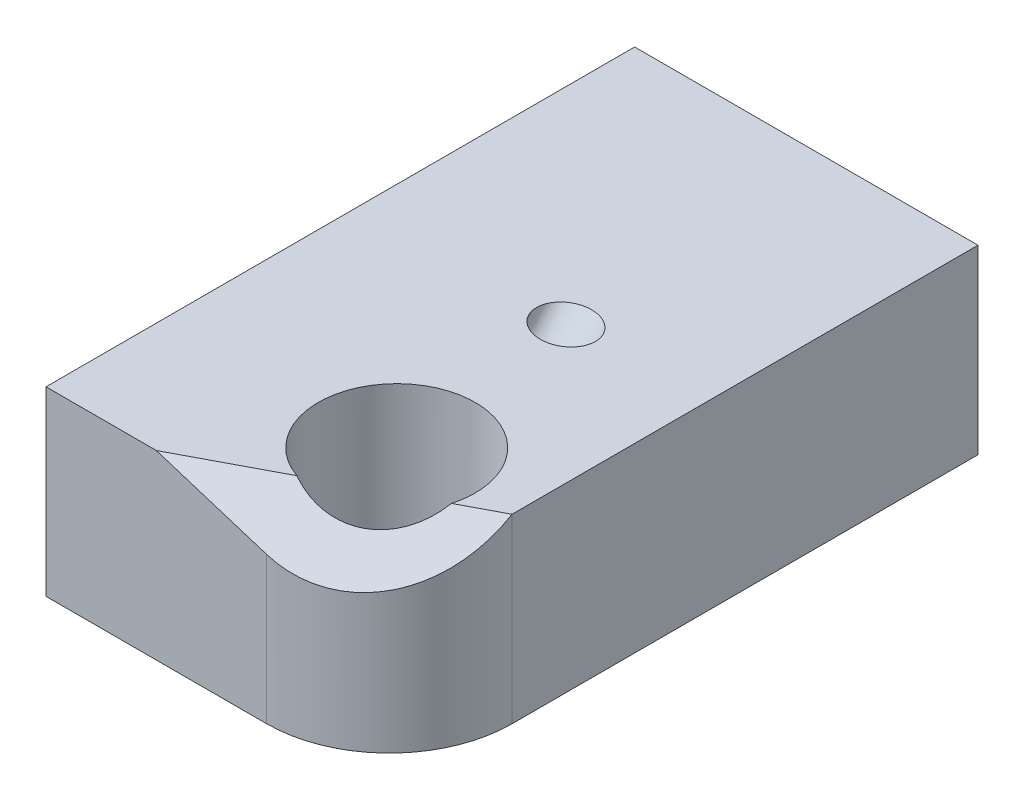
ISO-10303-21;
HEADER;
FILE_DESCRIPTION(('STEP AP214'),'2;1');
FILE_NAME('part.step','',(''),(''),'','','');
FILE_SCHEMA(('AUTOMOTIVE_DESIGN { 1 0 10303 214 1 1 1 1 }'));
ENDSEC;
DATA;
#1=APPLICATION_CONTEXT('core data for automotive mechanical design processes');
#2=APPLICATION_PROTOCOL_DEFINITION('international standard','automotive_design',2000,#1);
#3=PRODUCT_CONTEXT('',#1,'mechanical');
#4=PRODUCT('Part','Part','',(#3));
#5=PRODUCT_RELATED_PRODUCT_CATEGORY('part','',(#4));
#6=PRODUCT_DEFINITION_FORMATION('','',#4);
#7=PRODUCT_DEFINITION_CONTEXT('part definition',#1,'design');
#8=PRODUCT_DEFINITION('design','',#6,#7);
#9=PRODUCT_DEFINITION_SHAPE('','',#8);
#10=(LENGTH_UNIT() NAMED_UNIT(*) SI_UNIT(.MILLI.,.METRE.));
#11=(NAMED_UNIT(*) PLANE_ANGLE_UNIT() SI_UNIT($,.RADIAN.));
#12=(NAMED_UNIT(*) SI_UNIT($,.STERADIAN.) SOLID_ANGLE_UNIT());
#13=UNCERTAINTY_MEASURE_WITH_UNIT(LENGTH_MEASURE(1.E-05),#10,'distance_accuracy_value','');
#14=(GEOMETRIC_REPRESENTATION_CONTEXT(3) GLOBAL_UNCERTAINTY_ASSIGNED_CONTEXT((#13)) GLOBAL_UNIT_ASSIGNED_CONTEXT((#10,
#11,#12)) REPRESENTATION_CONTEXT('',''));
#15=CARTESIAN_POINT('',(0.,0.,0.));
#16=DIRECTION('',(0.,0.,1.));
#17=DIRECTION('',(1.,0.,0.));
#18=AXIS2_PLACEMENT_3D('',#15,#16,#17);
#19=CARTESIAN_POINT('',(44.45,46.99,76.2));
#20=DIRECTION('',(-1.,0.,0.));
#21=DIRECTION('',(0.,0.,1.));
#22=AXIS2_PLACEMENT_3D('',#19,#20,#21);
#23=PLANE('',#22);
#24=DIRECTION('',(0.,0.,-1.));
#25=VECTOR('',#24,1.);
#26=CARTESIAN_POINT('',(44.45,46.99,76.2));
#27=LINE('',#26,#25);
#28=CARTESIAN_POINT('',(44.45,46.99,44.45));
#29=VERTEX_POINT('',#28);
#30=CARTESIAN_POINT('',(44.45,46.99,-76.2));
#31=VERTEX_POINT('',#30);
#32=EDGE_CURVE('E136',#29,#31,#27,.T.);
#33=ORIENTED_EDGE('',*,*,#32,.F.);
#34=DIRECTION('',(0.,-1.,0.));
#35=VECTOR('',#34,1.);
#36=CARTESIAN_POINT('',(44.45,46.99,44.45));
#37=LINE('',#36,#35);
#38=CARTESIAN_POINT('',(44.45,0.,44.45));
#39=VERTEX_POINT('',#38);
#40=EDGE_CURVE('E162',#29,#39,#37,.T.);
#41=ORIENTED_EDGE('',*,*,#40,.T.);
#42=DIRECTION('',(0.,0.,-1.));
#43=VECTOR('',#42,1.);
#44=CARTESIAN_POINT('',(44.45,0.,76.2));
#45=LINE('',#44,#43);
#46=CARTESIAN_POINT('',(44.45,0.,-76.2));
#47=VERTEX_POINT('',#46);
#48=EDGE_CURVE('E135',#39,#47,#45,.T.);
#49=ORIENTED_EDGE('',*,*,#48,.T.);
#50=DIRECTION('',(0.,-1.,0.));
#51=VECTOR('',#50,1.);
#52=CARTESIAN_POINT('',(44.45,46.99,-76.2));
#53=LINE('',#52,#51);
#54=EDGE_CURVE('E159',#31,#47,#53,.T.);
#55=ORIENTED_EDGE('',*,*,#54,.F.);
#56=EDGE_LOOP('',(#33,#41,#49,#55));
#57=FACE_BOUND('',#56,.T.);
#58=ADVANCED_FACE('F45',(#57),#23,.F.);
#59=CARTESIAN_POINT('',(-44.4499999999999,46.99,-76.2));
#60=DIRECTION('',(0.,0.,1.));
#61=DIRECTION('',(1.,0.,0.));
#62=AXIS2_PLACEMENT_3D('',#59,#60,#61);
#63=PLANE('',#62);
#64=DIRECTION('',(-1.,0.,0.));
#65=VECTOR('',#64,1.);
#66=CARTESIAN_POINT('',(-44.4499999999999,0.,-76.2));
#67=LINE('',#66,#65);
#68=CARTESIAN_POINT('',(-44.4499999999999,0.,-76.2));
#69=VERTEX_POINT('',#68);
#70=EDGE_CURVE('E148',#47,#69,#67,.T.);
#71=ORIENTED_EDGE('',*,*,#70,.T.);
#72=DIRECTION('',(0.,-1.,0.));
#73=VECTOR('',#72,1.);
#74=CARTESIAN_POINT('',(-44.4499999999999,46.99,-76.2));
#75=LINE('',#74,#73);
#76=CARTESIAN_POINT('',(-44.4499999999999,46.99,-76.2));
#77=VERTEX_POINT('',#76);
#78=EDGE_CURVE('E156',#77,#69,#75,.T.);
#79=ORIENTED_EDGE('',*,*,#78,.F.);
#80=DIRECTION('',(-1.,0.,0.));
#81=VECTOR('',#80,1.);
#82=CARTESIAN_POINT('',(-44.4499999999999,46.99,-76.2));
#83=LINE('',#82,#81);
#84=EDGE_CURVE('E138',#31,#77,#83,.T.);
#85=ORIENTED_EDGE('',*,*,#84,.F.);
#86=ORIENTED_EDGE('',*,*,#54,.T.);
#87=EDGE_LOOP('',(#71,#79,#85,#86));
#88=FACE_BOUND('',#87,.T.);
#89=ADVANCED_FACE('F199',(#88),#63,.F.);
#90=CARTESIAN_POINT('',(-44.4499999999999,46.99,76.2));
#91=DIRECTION('',(1.,0.,0.));
#92=DIRECTION('',(0.,0.,-1.));
#93=AXIS2_PLACEMENT_3D('',#90,#91,#92);
#94=PLANE('',#93);
#95=DIRECTION('',(0.,0.,1.));
#96=VECTOR('',#95,1.);
#97=CARTESIAN_POINT('',(-44.4499999999999,0.,76.2));
#98=LINE('',#97,#96);
#99=CARTESIAN_POINT('',(-44.4499999999999,0.,76.2));
#100=VERTEX_POINT('',#99);
#101=EDGE_CURVE('E150',#69,#100,#98,.T.);
#102=ORIENTED_EDGE('',*,*,#101,.T.);
#103=DIRECTION('',(0.,-1.,0.));
#104=VECTOR('',#103,1.);
#105=CARTESIAN_POINT('',(-44.4499999999999,46.99,76.2));
#106=LINE('',#105,#104);
#107=CARTESIAN_POINT('',(-44.4499999999999,46.99,76.2));
#108=VERTEX_POINT('',#107);
#109=EDGE_CURVE('E146',#108,#100,#106,.T.);
#110=ORIENTED_EDGE('',*,*,#109,.F.);
#111=DIRECTION('',(0.,0.,1.));
#112=VECTOR('',#111,1.);
#113=CARTESIAN_POINT('',(-44.4499999999999,46.99,76.2));
#114=LINE('',#113,#112);
#115=EDGE_CURVE('E141',#77,#108,#114,.T.);
#116=ORIENTED_EDGE('',*,*,#115,.F.);
#117=ORIENTED_EDGE('',*,*,#78,.T.);
#118=EDGE_LOOP('',(#102,#110,#116,#117));
#119=FACE_BOUND('',#118,.T.);
#120=ADVANCED_FACE('F196',(#119),#94,.F.);
#121=CARTESIAN_POINT('',(-44.4499999999999,46.99,76.2));
#122=DIRECTION('',(0.,0.,-1.));
#123=DIRECTION('',(-1.,0.,0.));
#124=AXIS2_PLACEMENT_3D('',#121,#122,#123);
#125=PLANE('',#124);
#126=DIRECTION('',(0.,-1.,0.));
#127=VECTOR('',#126,1.);
#128=CARTESIAN_POINT('',(12.7,46.99,76.2));
#129=LINE('',#128,#127);
#130=CARTESIAN_POINT('',(12.7,0.,76.2));
#131=VERTEX_POINT('',#130);
#132=CARTESIAN_POINT('',(12.7,37.9663157894737,76.2));
#133=VERTEX_POINT('',#132);
#134=EDGE_CURVE('E167',#131,#133,#129,.F.);
#135=ORIENTED_EDGE('',*,*,#134,.T.);
#136=DIRECTION('',(0.953582665134142,-0.301131367937097,0.));
#137=VECTOR('',#136,1.);
#138=CARTESIAN_POINT('',(-15.8749999999999,46.99,76.2));
#139=LINE('',#138,#137);
#140=CARTESIAN_POINT('',(-15.8749999999999,46.99,76.2));
#141=VERTEX_POINT('',#140);
#142=EDGE_CURVE('E133',#141,#133,#139,.T.);
#143=ORIENTED_EDGE('',*,*,#142,.F.);
#144=DIRECTION('',(1.,0.,0.));
#145=VECTOR('',#144,1.);
#146=CARTESIAN_POINT('',(-44.4499999999999,46.99,76.2));
#147=LINE('',#146,#145);
#148=EDGE_CURVE('E143',#108,#141,#147,.T.);
#149=ORIENTED_EDGE('',*,*,#148,.F.);
#150=ORIENTED_EDGE('',*,*,#109,.T.);
#151=DIRECTION('',(1.,0.,0.));
#152=VECTOR('',#151,1.);
#153=CARTESIAN_POINT('',(-44.4499999999999,0.,76.2));
#154=LINE('',#153,#152);
#155=EDGE_CURVE('E139',#100,#131,#154,.T.);
#156=ORIENTED_EDGE('',*,*,#155,.T.);
#157=EDGE_LOOP('',(#135,#143,#149,#150,#156));
#158=FACE_BOUND('',#157,.T.);
#159=ADVANCED_FACE('F191',(#158),#125,.F.);
#160=CARTESIAN_POINT('',(0.,46.99,0.));
#161=DIRECTION('',(0.,-1.,0.));
#162=DIRECTION('',(0.,0.,-1.));
#163=AXIS2_PLACEMENT_3D('',#160,#161,#162);
#164=PLANE('',#163);
#165=CARTESIAN_POINT('',(16.51,46.99,-5.08000000000005));
#166=CARTESIAN_POINT('',(16.5100017338842,46.99,-4.93837959336253));
#167=CARTESIAN_POINT('',(16.5047841072791,46.99,-4.79677886798078));
#168=CARTESIAN_POINT('',(16.4839662909304,46.99,-4.51431092614211));
#169=CARTESIAN_POINT('',(16.4683643501392,46.99,-4.37344383743229));
#170=CARTESIAN_POINT('',(16.426717241521,46.99,-4.09189129089483));
#171=CARTESIAN_POINT('',(16.4005742357318,46.99,-3.95122028178295));
#172=CARTESIAN_POINT('',(16.3380947186572,46.99,-3.67214749142114));
#173=CARTESIAN_POINT('',(16.3017554363571,46.99,-3.53374633788127));
#174=CARTESIAN_POINT('',(16.1777848481939,46.99,-3.12266718406278));
#175=CARTESIAN_POINT('',(16.0752365855253,46.9899999999999,-2.85435167860637));
#176=CARTESIAN_POINT('',(15.8136542842507,46.9899999999999,-2.29121255073799));
#177=CARTESIAN_POINT('',(15.648041155401,46.99,-1.99946200696415));
#178=CARTESIAN_POINT('',(15.2740526261885,46.99,-1.44516677057615));
#179=CARTESIAN_POINT('',(15.0657073913006,46.99,-1.18260167586719));
#180=CARTESIAN_POINT('',(14.7178212555178,46.99,-0.804228609564162));
#181=CARTESIAN_POINT('',(14.5908630422466,46.99,-0.676584566386066));
#182=CARTESIAN_POINT('',(14.327670883046,46.99,-0.431308754337642));
#183=CARTESIAN_POINT('',(14.1914389644064,46.99,-0.313674809768483));
#184=CARTESIAN_POINT('',(13.7677351695528,46.99,0.025777866311205));
#185=CARTESIAN_POINT('',(13.4674236304181,46.9900000000001,0.231811840705243));
#186=CARTESIAN_POINT('',(12.8408875308063,46.9899999999999,0.600014134460905));
#187=CARTESIAN_POINT('',(12.5146411869224,46.9899999999998,0.762145063865037));
#188=CARTESIAN_POINT('',(11.980784220716,46.9899999999999,0.984481434481596));
#189=CARTESIAN_POINT('',(11.7791078388819,46.99,1.05927746897772));
#190=CARTESIAN_POINT('',(11.3707476277663,46.99,1.19307225912678));
#191=CARTESIAN_POINT('',(11.1640681964187,46.99,1.25208437639609));
#192=CARTESIAN_POINT('',(10.7468346998604,46.99,1.35433444147799));
#193=CARTESIAN_POINT('',(10.5362804080936,46.99,1.3975714638515));
#194=CARTESIAN_POINT('',(10.1125403445036,46.99,1.4682586329328));
#195=CARTESIAN_POINT('',(9.89935402372666,46.99,1.49570542750307));
#196=CARTESIAN_POINT('',(9.25775776803937,46.99,1.55429184688758));
#197=CARTESIAN_POINT('',(8.82693463817738,46.99,1.56176873551257));
#198=CARTESIAN_POINT('',(7.96905153260768,46.99,1.51349381854952));
#199=CARTESIAN_POINT('',(7.54199164993697,46.99,1.45774045414435));
#200=CARTESIAN_POINT('',(6.70058950827034,46.99,1.28296774158593));
#201=CARTESIAN_POINT('',(6.28624905934568,46.99,1.16393943267331));
#202=CARTESIAN_POINT('',(5.68257802114343,46.99,0.938414555421039));
#203=CARTESIAN_POINT('',(5.48422943171411,46.99,0.855353936576434));
#204=CARTESIAN_POINT('',(5.09473553489174,46.99,0.67361714693539));
#205=CARTESIAN_POINT('',(4.90359070345611,46.99,0.574939946571918));
#206=CARTESIAN_POINT('',(4.53482750158829,46.99,0.364882768618493));
#207=CARTESIAN_POINT('',(4.35698882571718,46.99,0.253889347253068));
#208=CARTESIAN_POINT('',(4.01117148196734,46.99,0.0175727957338662));
#209=CARTESIAN_POINT('',(3.84318902529931,46.99,-0.107744772790933));
#210=CARTESIAN_POINT('',(3.52966560552846,46.99,-0.363308705005646));
#211=CARTESIAN_POINT('',(3.38337546061366,46.99,-0.492635980815729));
#212=CARTESIAN_POINT('',(3.10181010279647,46.99,-0.763130942645601));
#213=CARTESIAN_POINT('',(2.96654850970638,46.99,-0.904312844843137));
#214=CARTESIAN_POINT('',(2.71503960515589,46.99,-1.19046528236714));
#215=CARTESIAN_POINT('',(2.59818130381933,46.99,-1.3348985076305));
#216=CARTESIAN_POINT('',(2.37704547718443,46.99,-1.63308878214079));
#217=CARTESIAN_POINT('',(2.27276647979994,46.99,-1.78684473722984));
#218=CARTESIAN_POINT('',(2.07802274207121,46.99,-2.10273580624533));
#219=CARTESIAN_POINT('',(1.98754841311545,46.99,-2.26486499845353));
#220=CARTESIAN_POINT('',(1.82148961087143,46.99,-2.59648758347231));
#221=CARTESIAN_POINT('',(1.7458972334691,46.99,-2.76597700840436));
#222=CARTESIAN_POINT('',(1.61332929128942,46.99,-3.10410818704556));
#223=CARTESIAN_POINT('',(1.55571852485826,46.99,-3.2725008505316));
#224=CARTESIAN_POINT('',(1.45582210162169,46.99,-3.61381947366057));
#225=CARTESIAN_POINT('',(1.4135390678655,46.9899999999999,-3.78674620379801));
#226=CARTESIAN_POINT('',(1.34776335314755,46.9899999999999,-4.12118197297303));
#227=CARTESIAN_POINT('',(1.32299860286574,46.99,-4.28244184510335));
#228=CARTESIAN_POINT('',(1.28714330931393,46.99,-4.60654287415993));
#229=CARTESIAN_POINT('',(1.2760579218319,46.99,-4.76938460400086));
#230=CARTESIAN_POINT('',(1.26771719285574,46.99,-5.09542621613874));
#231=CARTESIAN_POINT('',(1.27046226909798,46.99,-5.25862610910485));
#232=CARTESIAN_POINT('',(1.28974504618377,46.99,-5.58414094542372));
#233=CARTESIAN_POINT('',(1.30627706464198,46.99,-5.74645622563859));
#234=CARTESIAN_POINT('',(1.35257591985949,46.99,-6.06672082229006));
#235=CARTESIAN_POINT('',(1.3821424881116,46.99,-6.224699176269));
#236=CARTESIAN_POINT('',(1.45407518515231,46.99,-6.53753926696272));
#237=CARTESIAN_POINT('',(1.49642815292907,46.99,-6.69240403449234));
#238=CARTESIAN_POINT('',(1.59347512728372,46.99,-6.99822419778619));
#239=CARTESIAN_POINT('',(1.64817006815757,46.99,-7.14917929662084));
#240=CARTESIAN_POINT('',(1.76933685590226,46.99,-7.44633715650401));
#241=CARTESIAN_POINT('',(1.83581274713761,46.99,-7.59253826505813));
#242=CARTESIAN_POINT('',(1.98058057925463,46.99,-7.88077349720386));
#243=CARTESIAN_POINT('',(2.0589823357201,46.99,-8.02275247356997));
#244=CARTESIAN_POINT('',(2.22637016231893,46.99,-8.3003485612697));
#245=CARTESIAN_POINT('',(2.31535973198749,46.99,-8.43596354837922));
#246=CARTESIAN_POINT('',(2.59730645333546,46.99,-8.83267614493614));
#247=CARTESIAN_POINT('',(2.80511676827944,46.99,-9.08339564271861));
#248=CARTESIAN_POINT('',(3.283061813393,46.99,-9.58397388289304));
#249=CARTESIAN_POINT('',(3.55779610630219,46.9899999999999,-9.82940625658334));
#250=CARTESIAN_POINT('',(4.14037957429092,46.9900000000001,-10.2766368032572));
#251=CARTESIAN_POINT('',(4.44820649985465,46.9900000000002,-10.4784640223643));
#252=CARTESIAN_POINT('',(4.94689693604059,46.9900000000002,-10.7575778373878));
#253=CARTESIAN_POINT('',(5.1292541447586,46.99,-10.8504587400893));
#254=CARTESIAN_POINT('',(5.50039899540581,46.99,-11.0220555996778));
#255=CARTESIAN_POINT('',(5.68918222267259,46.99,-11.1007810567287));
#256=CARTESIAN_POINT('',(6.07204017008721,46.99,-11.2440122587567));
#257=CARTESIAN_POINT('',(6.26611445857618,46.99,-11.3085191598437));
#258=CARTESIAN_POINT('',(6.6584261605043,46.99,-11.4232786698191));
#259=CARTESIAN_POINT('',(6.85666428361473,46.99,-11.4735288273079));
#260=CARTESIAN_POINT('',(7.45584489441634,46.99,-11.602785127832));
#261=CARTESIAN_POINT('',(7.86160499923682,46.99,-11.6604272726881));
#262=CARTESIAN_POINT('',(8.67699388012742,46.99,-11.7184363990061));
#263=CARTESIAN_POINT('',(9.08662240979324,46.99,-11.7188070041711));
#264=CARTESIAN_POINT('',(9.90195368470638,46.99,-11.6623603085477));
#265=CARTESIAN_POINT('',(10.3076563094552,46.99,-11.6055412580126));
#266=CARTESIAN_POINT('',(11.1071311599117,46.9900000000001,-11.4346513835308));
#267=CARTESIAN_POINT('',(11.5009018680501,46.9900000000003,-11.3205733091941));
#268=CARTESIAN_POINT('',(12.0755064696593,46.9900000000002,-11.106933706711));
#269=CARTESIAN_POINT('',(12.2644487671257,46.99,-11.0285878849701));
#270=CARTESIAN_POINT('',(12.6359030652884,46.99,-10.8577578977664));
#271=CARTESIAN_POINT('',(12.8184145651814,46.99,-10.7652726341646));
#272=CARTESIAN_POINT('',(13.1757624684907,46.99,-10.5662784329624));
#273=CARTESIAN_POINT('',(13.3505944712814,46.99,-10.4597615910302));
#274=CARTESIAN_POINT('',(13.6910666726434,46.99,-10.23301330894));
#275=CARTESIAN_POINT('',(13.8567099096995,46.99,-10.1127864429993));
#276=CARTESIAN_POINT('',(14.1711224826114,46.99,-9.86392279077335));
#277=CARTESIAN_POINT('',(14.3202987631973,46.99,-9.73580051894623));
#278=CARTESIAN_POINT('',(14.6077130408446,46.99,-9.46746527304484));
#279=CARTESIAN_POINT('',(14.7459377582227,46.99,-9.32723803833542));
#280=CARTESIAN_POINT('',(15.0030508636626,46.99,-9.04293470490213));
#281=CARTESIAN_POINT('',(15.1225681767306,46.99,-8.89942770407047));
#282=CARTESIAN_POINT('',(15.3490936357792,46.99,-8.60286498683398));
#283=CARTESIAN_POINT('',(15.4561032486156,46.99,-8.44981039337007));
#284=CARTESIAN_POINT('',(15.6563789204223,46.99,-8.13504064308336));
#285=CARTESIAN_POINT('',(15.7496511964636,46.99,-7.97332944941569));
#286=CARTESIAN_POINT('',(15.92131412775,46.99,-7.64228623293696));
#287=CARTESIAN_POINT('',(15.9997126868497,46.99,-7.47295831715011));
#288=CARTESIAN_POINT('',(16.1405968570332,46.99,-7.12790944370636));
#289=CARTESIAN_POINT('',(16.2030917951045,46.9899999999999,-6.95219230256874));
#290=CARTESIAN_POINT('',(16.3112930276841,46.9900000000001,-6.59578088736076));
#291=CARTESIAN_POINT('',(16.3570104466548,46.9900000000002,-6.4150899969386));
#292=CARTESIAN_POINT('',(16.4324573486126,46.9900000000002,-6.04307691459118));
#293=CARTESIAN_POINT('',(16.4614971590661,46.9900000000001,-5.85161433709431));
#294=CARTESIAN_POINT('',(16.5002656433716,46.9899999999999,-5.46675538503063));
#295=CARTESIAN_POINT('',(16.5099976326667,46.99,-5.27335934820106));
#296=CARTESIAN_POINT('',(16.51,46.99,-5.08000000000005));
#297=B_SPLINE_CURVE_WITH_KNOTS('',3,(#165,#166,#167,#168,#169,#170,#171,#172,#173,#174,#175,
#176,#177,#178,#179,#180,#181,#182,#183,#184,#185,#186,#187,#188,#189,#190,#191,#192,#193,#194,
#195,#196,#197,#198,#199,#200,#201,#202,#203,#204,#205,#206,#207,#208,#209,#210,#211,#212,#213,
#214,#215,#216,#217,#218,#219,#220,#221,#222,#223,#224,#225,#226,#227,#228,#229,#230,#231,#232,
#233,#234,#235,#236,#237,#238,#239,#240,#241,#242,#243,#244,#245,#246,#247,#248,#249,#250,#251,
#252,#253,#254,#255,#256,#257,#258,#259,#260,#261,#262,#263,#264,#265,#266,#267,#268,#269,#270,
#271,#272,#273,#274,#275,#276,#277,#278,#279,#280,#281,#282,#283,#284,#285,#286,#287,#288,#289,
#290,#291,#292,#293,#294,#295,#296),.UNSPECIFIED.,.T.,.F.,(4,2,2,2,2,2,2,2,2,2,2,2,2,2,2,2,2,2,
2,2,2,2,2,2,2,2,2,2,2,2,2,2,2,2,2,2,2,2,2,2,2,2,2,2,2,2,2,2,2,2,2,2,2,2,2,2,2,2,2,2,2,2,2,2,2,
4),(0.,0.424730657260306,0.849532952575999,1.27837235093846,1.70732840690646,2.56595622901171,
3.56820433751345,4.56974735857415,5.10938619395527,5.64890743743535,6.73741397136264,
7.82684463519737,8.47157107248994,9.1157499872887,9.75996668648902,10.4043200972602,
11.6918777285118,12.9794671026464,14.2672388689346,14.9117933209853,15.5563902848158,
16.184605641019,16.8125779036648,17.3977206911428,17.9835754929987,18.5403040097664,
19.0969673123519,19.653242183472,20.2092208036107,20.7424498044102,21.2757700141567,
21.7646541952193,22.2537225817963,22.7428057403203,23.2316874193426,23.7133061504061,
24.1944308328268,24.675591948947,25.156918567327,25.6429806253516,26.1292037876107,
27.1024686584139,28.2033921810093,29.3035800834376,29.9170185204756,30.5300437104291,
31.1430190369349,31.7560996987211,32.9811472242166,34.2061172380842,35.4311247316757,
36.6562873802633,37.2694293835281,37.8826190306493,38.4961555915867,39.1094880475996,
39.6987744268549,40.2887647636972,40.8484040366643,41.4079776112636,41.9672971577515,
42.526318645637,43.0850115250057,43.6433332865917,44.2233326726279,44.8032324554257),.UNSPECIFIED.);
#298=CARTESIAN_POINT('',(16.51,46.99,-5.08000000000005));
#299=VERTEX_POINT('',#298);
#300=EDGE_CURVE('E117',#299,#299,#297,.T.);
#301=ORIENTED_EDGE('',*,*,#300,.T.);
#302=EDGE_LOOP('',(#301));
#303=FACE_BOUND('',#302,.T.);
#304=DIRECTION('',(-0.884918222381982,0.,0.465746432832623));
#305=VECTOR('',#304,1.);
#306=CARTESIAN_POINT('',(44.45,46.99,44.45));
#307=LINE('',#306,#305);
#308=CARTESIAN_POINT('',(7.96285824051031,46.99,63.6537588207841));
#309=VERTEX_POINT('',#308);
#310=EDGE_CURVE('E108',#309,#141,#307,.T.);
#311=ORIENTED_EDGE('',*,*,#310,.F.);
#312=CARTESIAN_POINT('',(14.605,46.99,44.45));
#313=DIRECTION('',(0.,1.,0.));
#314=DIRECTION('',(0.,0.,1.));
#315=AXIS2_PLACEMENT_3D('',#312,#313,#314);
#316=CIRCLE('',#315,20.32);
#317=CARTESIAN_POINT('',(34.1950810219627,46.99,49.8473257779144));
#318=VERTEX_POINT('',#317);
#319=EDGE_CURVE('E66',#318,#309,#316,.T.);
#320=ORIENTED_EDGE('',*,*,#319,.F.);
#321=EDGE_CURVE('E130',#29,#318,#307,.T.);
#322=ORIENTED_EDGE('',*,*,#321,.F.);
#323=ORIENTED_EDGE('',*,*,#32,.T.);
#324=ORIENTED_EDGE('',*,*,#84,.T.);
#325=ORIENTED_EDGE('',*,*,#115,.T.);
#326=ORIENTED_EDGE('',*,*,#148,.T.);
#327=EDGE_LOOP('',(#311,#320,#322,#323,#324,#325,#326));
#328=FACE_BOUND('',#327,.T.);
#329=ADVANCED_FACE('F180',(#303,#328),#164,.F.);
#330=CARTESIAN_POINT('',(0.,0.,0.));
#331=DIRECTION('',(0.,-1.,0.));
#332=DIRECTION('',(0.,0.,-1.));
#333=AXIS2_PLACEMENT_3D('',#330,#331,#332);
#334=PLANE('',#333);
#335=ORIENTED_EDGE('',*,*,#48,.F.);
#336=CARTESIAN_POINT('',(12.7,0.,44.45));
#337=DIRECTION('',(0.,-1.,0.));
#338=DIRECTION('',(0.,0.,-1.));
#339=AXIS2_PLACEMENT_3D('',#336,#337,#338);
#340=CIRCLE('',#339,31.75);
#341=EDGE_CURVE('E165',#39,#131,#340,.T.);
#342=ORIENTED_EDGE('',*,*,#341,.T.);
#343=ORIENTED_EDGE('',*,*,#155,.F.);
#344=ORIENTED_EDGE('',*,*,#101,.F.);
#345=ORIENTED_EDGE('',*,*,#70,.F.);
#346=EDGE_LOOP('',(#335,#342,#343,#344,#345));
#347=FACE_BOUND('',#346,.T.);
#348=ADVANCED_FACE('F187',(#347),#334,.T.);
#349=CARTESIAN_POINT('',(12.7,46.99,44.45));
#350=DIRECTION('',(0.,-1.,0.));
#351=DIRECTION('',(0.,0.,-1.));
#352=AXIS2_PLACEMENT_3D('',#349,#350,#351);
#353=CYLINDRICAL_SURFACE('',#352,31.75);
#354=CARTESIAN_POINT('',(12.7,57.0163157894737,44.45));
#355=DIRECTION('',(-0.261374024627471,-0.827684411320326,-0.496610646792195));
#356=DIRECTION('',(0.385491062083611,-0.561193830380667,0.732433017958861));
#357=AXIS2_PLACEMENT_3D('',#354,#355,#356);
#358=ELLIPSE('',#357,38.3600313908924,31.75);
#359=EDGE_CURVE('E53',#133,#29,#358,.F.);
#360=ORIENTED_EDGE('',*,*,#359,.F.);
#361=ORIENTED_EDGE('',*,*,#134,.F.);
#362=ORIENTED_EDGE('',*,*,#341,.F.);
#363=ORIENTED_EDGE('',*,*,#40,.F.);
#364=EDGE_LOOP('',(#360,#361,#362,#363));
#365=FACE_BOUND('',#364,.T.);
#366=ADVANCED_FACE('F47',(#365),#353,.T.);
#367=CARTESIAN_POINT('',(18.9719143768028,60.0777288598755,36.0466373159253));
#368=DIRECTION('',(-0.261374024627471,-0.827684411320326,-0.496610646792195));
#369=DIRECTION('',(0.,0.514495755427526,-0.857492925712544));
#370=AXIS2_PLACEMENT_3D('',#367,#368,#369);
#371=PLANE('',#370);
#372=ORIENTED_EDGE('',*,*,#321,.T.);
#373=CARTESIAN_POINT('',(14.605,56.4147368421053,44.45));
#374=DIRECTION('',(-0.261374024627471,-0.827684411320326,-0.496610646792195));
#375=DIRECTION('',(-0.385491062083611,0.561193830380667,-0.732433017958861));
#376=AXIS2_PLACEMENT_3D('',#373,#374,#375);
#377=ELLIPSE('',#376,24.5504200901711,20.32);
#378=EDGE_CURVE('E11',#318,#309,#377,.T.);
#379=ORIENTED_EDGE('',*,*,#378,.T.);
#380=ORIENTED_EDGE('',*,*,#310,.T.);
#381=ORIENTED_EDGE('',*,*,#142,.T.);
#382=ORIENTED_EDGE('',*,*,#359,.T.);
#383=EDGE_LOOP('',(#372,#379,#380,#381,#382));
#384=FACE_BOUND('',#383,.T.);
#385=ADVANCED_FACE('F172',(#384),#371,.F.);
#386=CARTESIAN_POINT('',(14.605,6.35,44.45));
#387=DIRECTION('',(0.,1.,0.));
#388=DIRECTION('',(0.,0.,1.));
#389=AXIS2_PLACEMENT_3D('',#386,#387,#388);
#390=CYLINDRICAL_SURFACE('',#389,20.32);
#391=CARTESIAN_POINT('',(14.605,6.35,44.45));
#392=DIRECTION('',(0.,1.,0.));
#393=DIRECTION('',(0.,0.,1.));
#394=AXIS2_PLACEMENT_3D('',#391,#392,#393);
#395=CIRCLE('',#394,20.32);
#396=CARTESIAN_POINT('',(1.27079803376989,6.35,29.1169814477454));
#397=VERTEX_POINT('',#396);
#398=CARTESIAN_POINT('',(14.0454226146678,6.34999999999999,24.1377063542833));
#399=VERTEX_POINT('',#398);
#400=EDGE_CURVE('E109',#397,#399,#395,.T.);
#401=ORIENTED_EDGE('',*,*,#400,.F.);
#402=CARTESIAN_POINT('',(16.51,12.072222822744,24.219493950966));
#403=CARTESIAN_POINT('',(16.5100004103658,12.2136345732787,24.21949425242));
#404=CARTESIAN_POINT('',(16.5063402388827,12.3550354786952,24.219148275509));
#405=CARTESIAN_POINT('',(16.4918395355012,12.6373697448591,24.2177908664568));
#406=CARTESIAN_POINT('',(16.4810035843239,12.7783033462702,24.2167798588463));
#407=CARTESIAN_POINT('',(16.4424725629563,13.1555446026026,24.2132334721808));
#408=CARTESIAN_POINT('',(16.4083168561358,13.3912151394317,24.2101285218941));
#409=CARTESIAN_POINT('',(16.3206192928287,13.8590284497877,24.2025069261554));
#410=CARTESIAN_POINT('',(16.2670643431174,14.091168730096,24.1979893275403));
#411=CARTESIAN_POINT('',(16.1413561189163,14.5491157540208,24.1880660775727));
#412=CARTESIAN_POINT('',(16.069295539052,14.7749480170121,24.1826648996504));
#413=CARTESIAN_POINT('',(15.9067533957437,15.2198758445915,24.1715760953605));
#414=CARTESIAN_POINT('',(15.8162729333566,15.4389718109442,24.1658884861298));
#415=CARTESIAN_POINT('',(15.6243707771293,15.8528411884831,24.1553746700939));
#416=CARTESIAN_POINT('',(15.5242487994571,16.0482164903031,24.1505158695049));
#417=CARTESIAN_POINT('',(15.308109957112,16.4304374548026,24.1418795211465));
#418=CARTESIAN_POINT('',(15.1920687347207,16.6172694499023,24.1381036582618));
#419=CARTESIAN_POINT('',(14.9576312649403,16.9604192010864,24.1327596580608));
#420=CARTESIAN_POINT('',(14.8408635441296,17.117845782481,24.1309960836133));
#421=CARTESIAN_POINT('',(14.594653076834,17.4226028462982,24.1296296316241));
#422=CARTESIAN_POINT('',(14.4652061571482,17.569929977307,24.1300274678463));
#423=CARTESIAN_POINT('',(14.1938582036182,17.8524127946747,24.1337070795562));
#424=CARTESIAN_POINT('',(14.0519672005902,17.9875781094562,24.1369865511284));
#425=CARTESIAN_POINT('',(13.7559877156349,18.2436320116094,24.1472053242817));
#426=CARTESIAN_POINT('',(13.6019054796124,18.3645278315347,24.1541427619736));
#427=CARTESIAN_POINT('',(13.3284654342819,18.5571082248975,24.1698171552931));
#428=CARTESIAN_POINT('',(13.211936937793,18.6329191934571,24.177455102242));
#429=CARTESIAN_POINT('',(12.9735128634686,18.7752125897006,24.1952492058249));
#430=CARTESIAN_POINT('',(12.8516186670331,18.8416974001637,24.2054047173941));
#431=CARTESIAN_POINT('',(12.6031713662969,18.9644173916888,24.2284613168979));
#432=CARTESIAN_POINT('',(12.4766232285078,19.0206631386495,24.2413595444153));
#433=CARTESIAN_POINT('',(12.2195204965564,19.1222193889772,24.2700937928286));
#434=CARTESIAN_POINT('',(12.0889658315057,19.1675296987352,24.2859298657295));
#435=CARTESIAN_POINT('',(11.8242458776059,19.2467722254006,24.3207253479135));
#436=CARTESIAN_POINT('',(11.6900678402785,19.2806563829973,24.339697461544));
#437=CARTESIAN_POINT('',(11.4197051398152,19.3364119502049,24.3807451702383));
#438=CARTESIAN_POINT('',(11.2835204873754,19.3582834238241,24.4028207487648));
#439=CARTESIAN_POINT('',(11.0102507995772,19.3899274254363,24.4500148024309));
#440=CARTESIAN_POINT('',(10.8731655807001,19.3996974053099,24.4751339172029));
#441=CARTESIAN_POINT('',(10.5992336055036,19.4073326173861,24.5282605423964));
#442=CARTESIAN_POINT('',(10.4623868484862,19.4051978844895,24.5562680443499));
#443=CARTESIAN_POINT('',(10.1970253438142,19.3898965302653,24.6134273964712));
#444=CARTESIAN_POINT('',(10.0684471749954,19.377308976186,24.6424441391794));
#445=CARTESIAN_POINT('',(9.81311453531941,19.3424196984199,24.7026593360018));
#446=CARTESIAN_POINT('',(9.68636064163928,19.3201149672305,24.7338584630604));
#447=CARTESIAN_POINT('',(9.30979339796334,19.2396179637522,24.8303611052324));
#448=CARTESIAN_POINT('',(9.06358606245761,19.1678369758633,24.8985890583027));
#449=CARTESIAN_POINT('',(8.44433851720957,18.9432727848783,25.0823630970177));
#450=CARTESIAN_POINT('',(8.08091423324997,18.7676608194013,25.202330590846));
#451=CARTESIAN_POINT('',(7.56272474210203,18.4635027513709,25.3884476776034));
#452=CARTESIAN_POINT('',(7.39424140486883,18.3551231770343,25.4516190100433));
#453=CARTESIAN_POINT('',(7.06595030659478,18.1267287551706,25.5794919715743));
#454=CARTESIAN_POINT('',(6.90614091631553,18.0067161045794,25.6441933099816));
#455=CARTESIAN_POINT('',(6.49262387323509,17.6747275630257,25.8174996034709));
#456=CARTESIAN_POINT('',(6.24621716509419,17.4541411317648,25.9270172339885));
#457=CARTESIAN_POINT('',(5.77492501374756,16.9924556741379,26.1470032544425));
#458=CARTESIAN_POINT('',(5.55001124672773,16.7513844576658,26.2574701780184));
#459=CARTESIAN_POINT('',(5.11978418482288,16.2531378767702,26.4780387454358));
#460=CARTESIAN_POINT('',(4.91443599933261,15.9959925867425,26.5881406882483));
#461=CARTESIAN_POINT('',(4.52120801236436,15.4681325610295,26.8071491278498));
#462=CARTESIAN_POINT('',(4.33333355355316,15.1974137138569,26.9160552500936));
#463=CARTESIAN_POINT('',(3.97400673695691,14.6448672537342,27.1315643843579));
#464=CARTESIAN_POINT('',(3.80253846590232,14.3630507874058,27.2381695488388));
#465=CARTESIAN_POINT('',(3.4749124771308,13.7895926412348,27.4481943995933));
#466=CARTESIAN_POINT('',(3.31875239084284,13.4979524907817,27.5516145769628));
#467=CARTESIAN_POINT('',(3.02120187392822,12.9059134878827,27.7541804454078));
#468=CARTESIAN_POINT('',(2.87980717227839,12.6055172005688,27.8533273676613));
#469=CARTESIAN_POINT('',(2.61156111989365,11.996464142177,28.0461255171428));
#470=CARTESIAN_POINT('',(2.48471374973103,11.6878051385416,28.139775236771));
#471=CARTESIAN_POINT('',(2.2459034358631,11.0624857463053,28.3199809752579));
#472=CARTESIAN_POINT('',(2.1339505654576,10.7458201132642,28.4065321782973));
#473=CARTESIAN_POINT('',(1.92615800692102,10.1050953810095,28.5702386424328));
#474=CARTESIAN_POINT('',(1.83030500222292,9.78104264634418,28.6474016540083));
#475=CARTESIAN_POINT('',(1.68476594201986,9.23125867420667,28.7663867680871));
#476=CARTESIAN_POINT('',(1.63016488320857,9.00755423144581,28.8115767082464));
#477=CARTESIAN_POINT('',(1.53027063343492,8.5562849155102,28.8949978589537));
#478=CARTESIAN_POINT('',(1.48499534803005,8.32871350765793,28.9332156671708));
#479=CARTESIAN_POINT('',(1.4126393442131,7.91155651876077,28.9947143569763));
#480=CARTESIAN_POINT('',(1.38375074369053,7.72250170352101,29.0194454910138));
#481=CARTESIAN_POINT('',(1.33465036624692,7.3423455455154,29.0616514091323));
#482=CARTESIAN_POINT('',(1.31444208658585,7.15124340961581,29.0791232683934));
#483=CARTESIAN_POINT('',(1.28448910380287,6.76799205166785,29.1050727090077));
#484=CARTESIAN_POINT('',(1.27472023522995,6.57584628720924,29.113571061947));
#485=CARTESIAN_POINT('',(1.26793020126408,6.19126899520734,29.1194749430363));
#486=CARTESIAN_POINT('',(1.27089649665141,5.99883793515884,29.1168913825948));
#487=CARTESIAN_POINT('',(1.29284743779509,5.61337247766333,29.0978248616387));
#488=CARTESIAN_POINT('',(1.31199190074633,5.42035127578268,29.0812032259404));
#489=CARTESIAN_POINT('',(1.355887344952,5.13489082050076,29.0433863710094));
#490=CARTESIAN_POINT('',(1.37305211968651,5.04040406218637,29.0286306392753));
#491=CARTESIAN_POINT('',(1.41297425124338,4.85349355553261,28.9944650852092));
#492=CARTESIAN_POINT('',(1.43572890111491,4.76106883219426,28.9750575156846));
#493=CARTESIAN_POINT('',(1.48769149314157,4.57777776447806,28.9309860926785));
#494=CARTESIAN_POINT('',(1.51698882408708,4.48695388920876,28.9062496172723));
#495=CARTESIAN_POINT('',(1.5822182233621,4.30932943172459,28.8515588832248));
#496=CARTESIAN_POINT('',(1.61814995344477,4.22252864467955,28.8216048905968));
#497=CARTESIAN_POINT('',(1.69675295404971,4.05419747318714,28.7566207888639));
#498=CARTESIAN_POINT('',(1.73941356105145,3.97265903263116,28.7215987184733));
#499=CARTESIAN_POINT('',(1.83140117069587,3.81575942926383,28.6468015948696));
#500=CARTESIAN_POINT('',(1.88072720113945,3.74039736815438,28.6070272349093));
#501=CARTESIAN_POINT('',(1.97797853293917,3.60716525212742,28.5294468975086));
#502=CARTESIAN_POINT('',(2.02505824294077,3.54834731888015,28.4922003755161));
#503=CARTESIAN_POINT('',(2.12341642862034,3.43611215968176,28.4151512780987));
#504=CARTESIAN_POINT('',(2.1746961940174,3.38269660398703,28.3753479183564));
#505=CARTESIAN_POINT('',(2.28102500846263,3.2813797710058,28.2936843454135));
#506=CARTESIAN_POINT('',(2.33607717380098,3.23348314252183,28.2518224399572));
#507=CARTESIAN_POINT('',(2.4494363811705,3.14319528097788,28.166581818757));
#508=CARTESIAN_POINT('',(2.50774433493765,3.10080560122587,28.1232026794174));
#509=CARTESIAN_POINT('',(2.6500409610683,3.0061150035048,28.0185714133913));
#510=CARTESIAN_POINT('',(2.73530326085941,2.95624681389214,27.9568444158234));
#511=CARTESIAN_POINT('',(2.91002149068328,2.8659365785973,27.8324974747383));
#512=CARTESIAN_POINT('',(2.99947819326113,2.82549627764515,27.7698773682138));
#513=CARTESIAN_POINT('',(3.18184145857594,2.75304310256272,27.644461798362));
#514=CARTESIAN_POINT('',(3.27475365630325,2.72104475025448,27.5816662182489));
#515=CARTESIAN_POINT('',(3.4631589972141,2.66463734271351,27.456631369035));
#516=CARTESIAN_POINT('',(3.55865175577094,2.64022716318841,27.3943920188496));
#517=CARTESIAN_POINT('',(3.81940120279835,2.58333694287942,27.2275962851857));
#518=CARTESIAN_POINT('',(3.98663854048904,2.55719455658365,27.12395917901));
#519=CARTESIAN_POINT('',(4.32500268748166,2.52073732183197,26.9210813386593));
#520=CARTESIAN_POINT('',(4.49612421449548,2.5104021483459,26.8218351184627));
#521=CARTESIAN_POINT('',(4.84104328042835,2.50280107428311,26.6284804205945));
#522=CARTESIAN_POINT('',(5.0148348868136,2.50550948024148,26.5343622114321));
#523=CARTESIAN_POINT('',(5.36472198888699,2.52195552349301,26.3514182113097));
#524=CARTESIAN_POINT('',(5.54081839606068,2.53569766244853,26.2625945963884));
#525=CARTESIAN_POINT('',(5.86619013569399,2.56977539840447,26.1043505542935));
#526=CARTESIAN_POINT('',(6.01521909662856,2.58869324989133,26.0341086014524));
#527=CARTESIAN_POINT('',(6.31419653649491,2.632636692185,25.8975877934884));
#528=CARTESIAN_POINT('',(6.46414512218198,2.65766300570033,25.8313094084619));
#529=CARTESIAN_POINT('',(6.91508294135014,2.74115075434937,25.6384498118956));
#530=CARTESIAN_POINT('',(7.21712633255191,2.80801676561649,25.5178625569785));
#531=CARTESIAN_POINT('',(7.82167670249144,2.9614413247829,25.2929424314537));
#532=CARTESIAN_POINT('',(8.12418251863027,3.04797337956665,25.1885880084816));
#533=CARTESIAN_POINT('',(8.72831615566707,3.23957916096627,24.9957593301105));
#534=CARTESIAN_POINT('',(9.02994412273384,3.34464959719224,24.9072822622408));
#535=CARTESIAN_POINT('',(9.63041618516775,3.57304612716918,24.7458745224435));
#536=CARTESIAN_POINT('',(9.92926040082762,3.69637142815616,24.6729431757387));
#537=CARTESIAN_POINT('',(10.5219574055566,3.96170837275618,24.5421310402648));
#538=CARTESIAN_POINT('',(10.8158097759263,4.10372157519576,24.484251508223));
#539=CARTESIAN_POINT('',(11.39599472099,4.40747717571859,24.3828262935686));
#540=CARTESIAN_POINT('',(11.6823217646949,4.56923361768467,24.3392908967114));
#541=CARTESIAN_POINT('',(12.2439124991274,4.91370219668491,24.2656545721944));
#542=CARTESIAN_POINT('',(12.5191778763646,5.09641112271768,24.2355515894452));
#543=CARTESIAN_POINT('',(13.0132712713781,5.45427504746008,24.1911619092833));
#544=CARTESIAN_POINT('',(13.2342521689102,5.62624259414261,24.1751510649234));
#545=CARTESIAN_POINT('',(13.6625363952571,5.98695068555369,24.1507358471701));
#546=CARTESIAN_POINT('',(13.8698427970203,6.17568743935848,24.1423297593912));
#547=CARTESIAN_POINT('',(14.2410255933589,6.54402811031735,24.1325277534874));
#548=CARTESIAN_POINT('',(14.4070059048876,6.72148989424876,24.1303460642657));
#549=CARTESIAN_POINT('',(14.7240696318807,7.08929522515367,24.1297305729875));
#550=CARTESIAN_POINT('',(14.8751546015841,7.27963742463109,24.1312963794708));
#551=CARTESIAN_POINT('',(15.1472174033426,7.65478357658605,24.1368218457949));
#552=CARTESIAN_POINT('',(15.2696842616559,7.83851065061242,24.140550272304));
#553=CARTESIAN_POINT('',(15.4989425293107,8.21543298486832,24.1493489826518));
#554=CARTESIAN_POINT('',(15.6057379584767,8.40862580005374,24.1544189214451));
#555=CARTESIAN_POINT('',(15.7983614926036,8.79531808132728,24.1648523619712));
#556=CARTESIAN_POINT('',(15.8848708171033,8.98847878349554,24.1701952420919));
#557=CARTESIAN_POINT('',(16.0415567024762,9.38148889807341,24.1806910616923));
#558=CARTESIAN_POINT('',(16.1117217653054,9.58134290679351,24.1858438653229));
#559=CARTESIAN_POINT('',(16.2298264565357,9.96878612269546,24.1949874026105));
#560=CARTESIAN_POINT('',(16.2791589308203,10.1559511127508,24.1990399749872));
#561=CARTESIAN_POINT('',(16.3635757133745,10.5335538017098,24.2061957600748));
#562=CARTESIAN_POINT('',(16.3986550291198,10.723992623051,24.2092986400385));
#563=CARTESIAN_POINT('',(16.4545858652024,11.1068953257405,24.2143329978325));
#564=CARTESIAN_POINT('',(16.4754415982036,11.2993585903371,24.2162648224808));
#565=CARTESIAN_POINT('',(16.5031482223981,11.6852956253317,24.2188450779584));
#566=CARTESIAN_POINT('',(16.5099994386133,11.8787693721734,24.2194935385724));
#567=CARTESIAN_POINT('',(16.51,12.072222822744,24.219493950966));
#568=B_SPLINE_CURVE_WITH_KNOTS('',3,(#402,#403,#404,#405,#406,#407,#408,#409,#410,#411,#412,
#413,#414,#415,#416,#417,#418,#419,#420,#421,#422,#423,#424,#425,#426,#427,#428,#429,#430,#431,
#432,#433,#434,#435,#436,#437,#438,#439,#440,#441,#442,#443,#444,#445,#446,#447,#448,#449,#450,
#451,#452,#453,#454,#455,#456,#457,#458,#459,#460,#461,#462,#463,#464,#465,#466,#467,#468,#469,
#470,#471,#472,#473,#474,#475,#476,#477,#478,#479,#480,#481,#482,#483,#484,#485,#486,#487,#488,
#489,#490,#491,#492,#493,#494,#495,#496,#497,#498,#499,#500,#501,#502,#503,#504,#505,#506,#507,
#508,#509,#510,#511,#512,#513,#514,#515,#516,#517,#518,#519,#520,#521,#522,#523,#524,#525,#526,
#527,#528,#529,#530,#531,#532,#533,#534,#535,#536,#537,#538,#539,#540,#541,#542,#543,#544,#545,
#546,#547,#548,#549,#550,#551,#552,#553,#554,#555,#556,#557,#558,#559,#560,#561,#562,#563,#564,
#565,#566,#567),.UNSPECIFIED.,.T.,.F.,(4,2,2,2,2,2,2,2,2,2,2,2,2,2,2,2,2,2,2,2,2,2,2,2,2,2,2,2,
2,2,2,2,2,2,2,2,2,2,2,2,2,2,2,2,2,2,2,2,2,2,2,2,2,2,2,2,2,2,2,2,2,2,2,2,2,2,2,2,2,2,2,2,2,2,2,2,
2,2,2,2,2,2,4),(0.,0.424166449410131,0.848062389177952,1.56162589811617,2.27567191603663,
2.98620876665217,3.69670315706707,4.35477894537723,5.01387311224063,5.60128962188803,
6.18890012625861,6.77604125329423,7.36288349567561,7.78017619014918,8.19736207381201,
8.61411498383514,9.03087527181906,9.449367237676,9.86785697362329,10.2864348127948,
10.705011424834,11.1018355644877,11.498782610044,12.2924074577959,13.5481023609506,
14.1779423189286,14.8076635609332,15.8511688225859,16.8932794002852,17.9334954034881,
18.9740284187573,20.0135417087432,21.0528939045022,22.0919446204283,23.1312789758431,
24.1713127085593,25.2104819236134,25.9142192097122,26.6192953345535,27.1975396264048,
27.7760166721076,28.35315172233,28.9297186477383,29.5120487250332,29.8032883150508,
30.0943871465564,30.3897370822644,30.6850719640681,30.9799434341407,31.2747719414558,
31.5265857889646,31.7784772534419,32.0305793681327,32.2827524378903,32.6316265450863,
32.9805651639488,33.3301001692773,33.6795833614675,34.2740467960411,34.867745220659,
35.4602746468986,36.0530459426511,36.5503816631629,37.0477762533422,38.0426920563218,
39.036275420535,40.0296826100422,41.0230466709624,42.0164936446147,43.0106514471614,
44.0046570965438,44.8452266316791,45.6856066249634,46.4138436990022,47.1420047053041,
47.8037872120012,48.4653996692969,49.0998273217431,49.7346999495706,50.314948564407,
50.8954002509481,51.4756799476998,52.0559461769512),.UNSPECIFIED.);
#569=EDGE_CURVE('E115',#399,#397,#568,.T.);
#570=ORIENTED_EDGE('',*,*,#569,.F.);
#571=EDGE_LOOP('',(#401,#570));
#572=FACE_BOUND('',#571,.T.);
#573=ORIENTED_EDGE('',*,*,#319,.T.);
#574=ORIENTED_EDGE('',*,*,#378,.F.);
#575=EDGE_LOOP('',(#573,#574));
#576=FACE_BOUND('',#575,.T.);
#577=ADVANCED_FACE('F120',(#572,#576),#390,.F.);
#578=CARTESIAN_POINT('',(14.605,6.35,44.45));
#579=DIRECTION('',(0.,1.,0.));
#580=DIRECTION('',(0.,0.,1.));
#581=AXIS2_PLACEMENT_3D('',#578,#579,#580);
#582=PLANE('',#581);
#583=EDGE_CURVE('E104',#399,#397,#395,.T.);
#584=ORIENTED_EDGE('',*,*,#583,.T.);
#585=ORIENTED_EDGE('',*,*,#400,.T.);
#586=EDGE_LOOP('',(#584,#585));
#587=FACE_BOUND('',#586,.T.);
#588=ADVANCED_FACE('F121',(#587),#582,.T.);
#589=CARTESIAN_POINT('',(8.89000000000004,-20.608530244666,51.6419017964255));
#590=DIRECTION('',(0.,0.766044443118977,-0.64278760968654));
#591=DIRECTION('',(1.,0.,0.));
#592=AXIS2_PLACEMENT_3D('',#589,#590,#591);
#593=ELLIPSE('',#592,7.62,5.08);
#594=DIRECTION('',(0.,0.766044443118977,-0.64278760968654));
#595=VECTOR('',#594,1.);
#596=SURFACE_OF_LINEAR_EXTRUSION('',#593,#595);
#597=EDGE_CURVE('E59',#397,#399,#568,.T.);
#598=ORIENTED_EDGE('',*,*,#597,.T.);
#599=ORIENTED_EDGE('',*,*,#569,.T.);
#600=EDGE_LOOP('',(#598,#599));
#601=FACE_BOUND('',#600,.T.);
#602=ORIENTED_EDGE('',*,*,#300,.F.);
#603=EDGE_LOOP('',(#602));
#604=FACE_BOUND('',#603,.T.);
#605=ADVANCED_FACE('F113',(#601,#604),#596,.F.);
#606=CARTESIAN_POINT('',(14.605,6.35,44.45));
#607=DIRECTION('',(0.,1.,0.));
#608=DIRECTION('',(0.,0.,1.));
#609=AXIS2_PLACEMENT_3D('',#606,#607,#608);
#610=CYLINDRICAL_SURFACE('',#609,20.32);
#611=ORIENTED_EDGE('',*,*,#597,.F.);
#612=ORIENTED_EDGE('',*,*,#583,.F.);
#613=EDGE_LOOP('',(#611,#612));
#614=FACE_BOUND('',#613,.T.);
#615=ADVANCED_FACE('F105',(#614),#610,.T.);
#616=CLOSED_SHELL('',(#58,#89,#120,#159,#329,#348,#366,#385,#577,#588,#605,#615));
#617=MANIFOLD_SOLID_BREP('B2',#616);
#618=ADVANCED_BREP_SHAPE_REPRESENTATION('',(#18,#617),#14);
#619=SHAPE_DEFINITION_REPRESENTATION(#9,#618);
ENDSEC;
END-ISO-10303-21;
